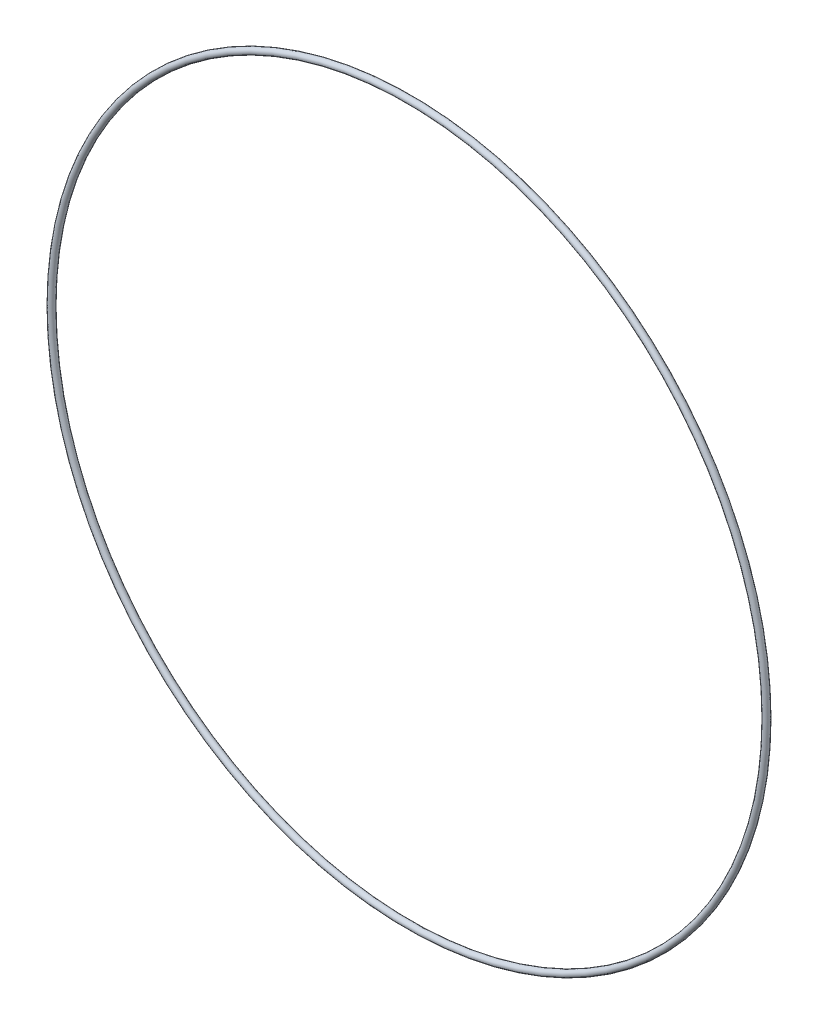
ISO-10303-21;
HEADER;
FILE_DESCRIPTION(('STEP AP214'),'2;1');
FILE_NAME('part.step','',(''),(''),'','','');
FILE_SCHEMA(('AUTOMOTIVE_DESIGN { 1 0 10303 214 1 1 1 1 }'));
ENDSEC;
DATA;
#1=APPLICATION_CONTEXT('core data for automotive mechanical design processes');
#2=APPLICATION_PROTOCOL_DEFINITION('international standard','automotive_design',2000,#1);
#3=PRODUCT_CONTEXT('',#1,'mechanical');
#4=PRODUCT('Part','Part','',(#3));
#5=PRODUCT_RELATED_PRODUCT_CATEGORY('part','',(#4));
#6=PRODUCT_DEFINITION_FORMATION('','',#4);
#7=PRODUCT_DEFINITION_CONTEXT('part definition',#1,'design');
#8=PRODUCT_DEFINITION('design','',#6,#7);
#9=PRODUCT_DEFINITION_SHAPE('','',#8);
#10=(LENGTH_UNIT() NAMED_UNIT(*) SI_UNIT(.MILLI.,.METRE.));
#11=(NAMED_UNIT(*) PLANE_ANGLE_UNIT() SI_UNIT($,.RADIAN.));
#12=(NAMED_UNIT(*) SI_UNIT($,.STERADIAN.) SOLID_ANGLE_UNIT());
#13=UNCERTAINTY_MEASURE_WITH_UNIT(LENGTH_MEASURE(1.E-05),#10,'distance_accuracy_value','');
#14=(GEOMETRIC_REPRESENTATION_CONTEXT(3) GLOBAL_UNCERTAINTY_ASSIGNED_CONTEXT((#13)) GLOBAL_UNIT_ASSIGNED_CONTEXT((#10,
#11,#12)) REPRESENTATION_CONTEXT('',''));
#15=CARTESIAN_POINT('',(0.,0.,0.));
#16=DIRECTION('',(0.,0.,1.));
#17=DIRECTION('',(1.,0.,0.));
#18=AXIS2_PLACEMENT_3D('',#15,#16,#17);
#19=CARTESIAN_POINT('',(0.,0.,0.));
#20=DIRECTION('',(0.,0.,1.));
#21=DIRECTION('',(1.,0.,0.));
#22=AXIS2_PLACEMENT_3D('',#19,#20,#21);
#23=TOROIDAL_SURFACE('',#22,111.5,1.);
#24=CARTESIAN_POINT('',(112.5,0.,0.));
#25=VERTEX_POINT('',#24);
#26=VERTEX_LOOP('',#25);
#27=FACE_BOUND('',#26,.T.);
#28=ADVANCED_FACE('F35',(#27),#23,.T.);
#29=CLOSED_SHELL('',(#28));
#30=MANIFOLD_SOLID_BREP('B2',#29);
#31=ADVANCED_BREP_SHAPE_REPRESENTATION('',(#18,#30),#14);
#32=SHAPE_DEFINITION_REPRESENTATION(#9,#31);
ENDSEC;
END-ISO-10303-21;
